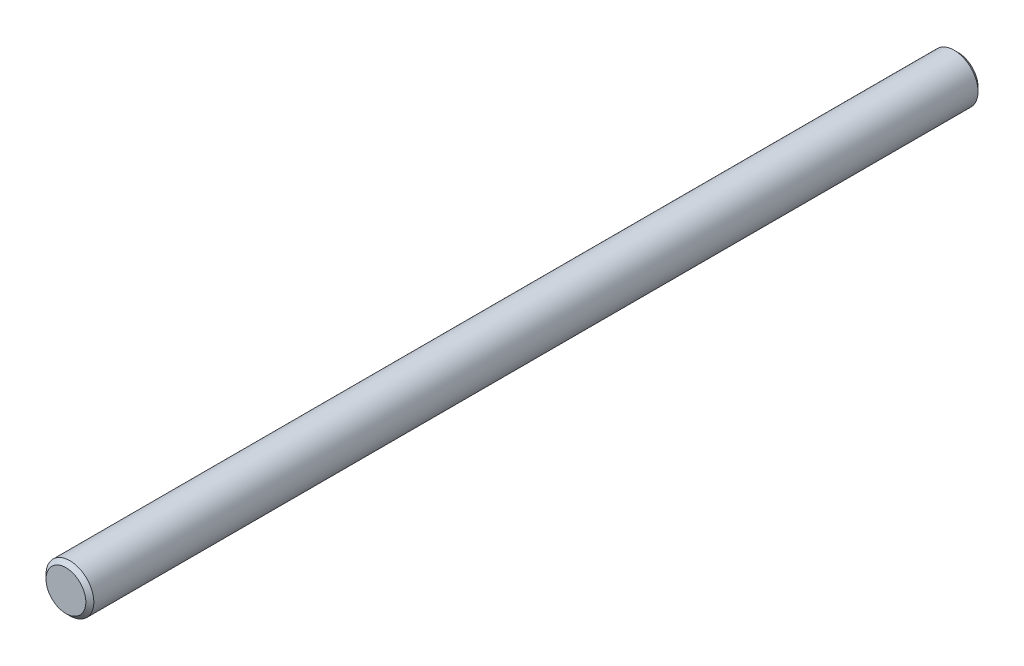
ISO-10303-21;
HEADER;
FILE_DESCRIPTION(('STEP AP214'),'2;1');
FILE_NAME('part.step','',(''),(''),'','','');
FILE_SCHEMA(('AUTOMOTIVE_DESIGN { 1 0 10303 214 1 1 1 1 }'));
ENDSEC;
DATA;
#1=APPLICATION_CONTEXT('core data for automotive mechanical design processes');
#2=APPLICATION_PROTOCOL_DEFINITION('international standard','automotive_design',2000,#1);
#3=PRODUCT_CONTEXT('',#1,'mechanical');
#4=PRODUCT('Part','Part','',(#3));
#5=PRODUCT_RELATED_PRODUCT_CATEGORY('part','',(#4));
#6=PRODUCT_DEFINITION_FORMATION('','',#4);
#7=PRODUCT_DEFINITION_CONTEXT('part definition',#1,'design');
#8=PRODUCT_DEFINITION('design','',#6,#7);
#9=PRODUCT_DEFINITION_SHAPE('','',#8);
#10=(LENGTH_UNIT() NAMED_UNIT(*) SI_UNIT(.MILLI.,.METRE.));
#11=(NAMED_UNIT(*) PLANE_ANGLE_UNIT() SI_UNIT($,.RADIAN.));
#12=(NAMED_UNIT(*) SI_UNIT($,.STERADIAN.) SOLID_ANGLE_UNIT());
#13=UNCERTAINTY_MEASURE_WITH_UNIT(LENGTH_MEASURE(1.E-05),#10,'distance_accuracy_value','');
#14=(GEOMETRIC_REPRESENTATION_CONTEXT(3) GLOBAL_UNCERTAINTY_ASSIGNED_CONTEXT((#13)) GLOBAL_UNIT_ASSIGNED_CONTEXT((#10,
#11,#12)) REPRESENTATION_CONTEXT('',''));
#15=CARTESIAN_POINT('',(0.,0.,0.));
#16=DIRECTION('',(0.,0.,1.));
#17=DIRECTION('',(1.,0.,0.));
#18=AXIS2_PLACEMENT_3D('',#15,#16,#17);
#19=CARTESIAN_POINT('',(0.,0.,-28.));
#20=DIRECTION('',(0.,0.,1.));
#21=DIRECTION('',(1.,0.,0.));
#22=AXIS2_PLACEMENT_3D('',#19,#20,#21);
#23=CONICAL_SURFACE('',#22,1.25,0.785398163397447);
#24=CARTESIAN_POINT('',(0.,0.,-27.75));
#25=DIRECTION('',(0.,0.,-1.));
#26=DIRECTION('',(-1.,0.,0.));
#27=AXIS2_PLACEMENT_3D('',#24,#25,#26);
#28=CIRCLE('',#27,1.5);
#29=CARTESIAN_POINT('',(-1.49999999999999,0.,-27.75));
#30=VERTEX_POINT('',#29);
#31=EDGE_CURVE('E10',#30,#30,#28,.T.);
#32=ORIENTED_EDGE('',*,*,#31,.T.);
#33=EDGE_LOOP('',(#32));
#34=FACE_BOUND('',#33,.T.);
#35=CARTESIAN_POINT('',(0.,0.,-28.));
#36=DIRECTION('',(0.,0.,-1.));
#37=DIRECTION('',(-1.,0.,0.));
#38=AXIS2_PLACEMENT_3D('',#35,#36,#37);
#39=CIRCLE('',#38,1.25);
#40=CARTESIAN_POINT('',(-1.24999999999999,0.,-28.));
#41=VERTEX_POINT('',#40);
#42=EDGE_CURVE('E44',#41,#41,#39,.T.);
#43=ORIENTED_EDGE('',*,*,#42,.F.);
#44=EDGE_LOOP('',(#43));
#45=FACE_BOUND('',#44,.T.);
#46=ADVANCED_FACE('F30',(#34,#45),#23,.T.);
#47=CARTESIAN_POINT('',(0.,0.,28.));
#48=DIRECTION('',(0.,0.,-1.));
#49=DIRECTION('',(-1.,0.,0.));
#50=AXIS2_PLACEMENT_3D('',#47,#48,#49);
#51=CYLINDRICAL_SURFACE('',#50,1.5);
#52=CARTESIAN_POINT('',(0.,0.,27.75));
#53=DIRECTION('',(0.,0.,-1.));
#54=DIRECTION('',(-1.,0.,0.));
#55=AXIS2_PLACEMENT_3D('',#52,#53,#54);
#56=CIRCLE('',#55,1.5);
#57=CARTESIAN_POINT('',(-1.49999999999999,0.,27.75));
#58=VERTEX_POINT('',#57);
#59=EDGE_CURVE('E36',#58,#58,#56,.T.);
#60=ORIENTED_EDGE('',*,*,#59,.T.);
#61=EDGE_LOOP('',(#60));
#62=FACE_BOUND('',#61,.T.);
#63=ORIENTED_EDGE('',*,*,#31,.F.);
#64=EDGE_LOOP('',(#63));
#65=FACE_BOUND('',#64,.T.);
#66=ADVANCED_FACE('F53',(#62,#65),#51,.T.);
#67=CARTESIAN_POINT('',(0.,0.,27.75));
#68=DIRECTION('',(0.,0.,-1.));
#69=DIRECTION('',(-1.,0.,0.));
#70=AXIS2_PLACEMENT_3D('',#67,#68,#69);
#71=CONICAL_SURFACE('',#70,1.5,0.785398163397447);
#72=CARTESIAN_POINT('',(0.,0.,28.));
#73=DIRECTION('',(0.,0.,-1.));
#74=DIRECTION('',(-1.,0.,0.));
#75=AXIS2_PLACEMENT_3D('',#72,#73,#74);
#76=CIRCLE('',#75,1.25);
#77=CARTESIAN_POINT('',(-1.24999999999999,0.,28.));
#78=VERTEX_POINT('',#77);
#79=EDGE_CURVE('E40',#78,#78,#76,.T.);
#80=ORIENTED_EDGE('',*,*,#79,.T.);
#81=EDGE_LOOP('',(#80));
#82=FACE_BOUND('',#81,.T.);
#83=ORIENTED_EDGE('',*,*,#59,.F.);
#84=EDGE_LOOP('',(#83));
#85=FACE_BOUND('',#84,.T.);
#86=ADVANCED_FACE('F57',(#82,#85),#71,.T.);
#87=CARTESIAN_POINT('',(1.25000000000001,0.,28.));
#88=DIRECTION('',(0.,0.,1.));
#89=DIRECTION('',(1.,0.,0.));
#90=AXIS2_PLACEMENT_3D('',#87,#88,#89);
#91=PLANE('',#90);
#92=ORIENTED_EDGE('',*,*,#79,.F.);
#93=EDGE_LOOP('',(#92));
#94=FACE_BOUND('',#93,.T.);
#95=ADVANCED_FACE('F61',(#94),#91,.T.);
#96=CARTESIAN_POINT('',(0.,0.,-28.));
#97=DIRECTION('',(0.,0.,-1.));
#98=DIRECTION('',(-1.,0.,0.));
#99=AXIS2_PLACEMENT_3D('',#96,#97,#98);
#100=PLANE('',#99);
#101=ORIENTED_EDGE('',*,*,#42,.T.);
#102=EDGE_LOOP('',(#101));
#103=FACE_BOUND('',#102,.T.);
#104=ADVANCED_FACE('F50',(#103),#100,.T.);
#105=CLOSED_SHELL('',(#46,#66,#86,#95,#104));
#106=MANIFOLD_SOLID_BREP('B2',#105);
#107=ADVANCED_BREP_SHAPE_REPRESENTATION('',(#18,#106),#14);
#108=SHAPE_DEFINITION_REPRESENTATION(#9,#107);
ENDSEC;
END-ISO-10303-21;
